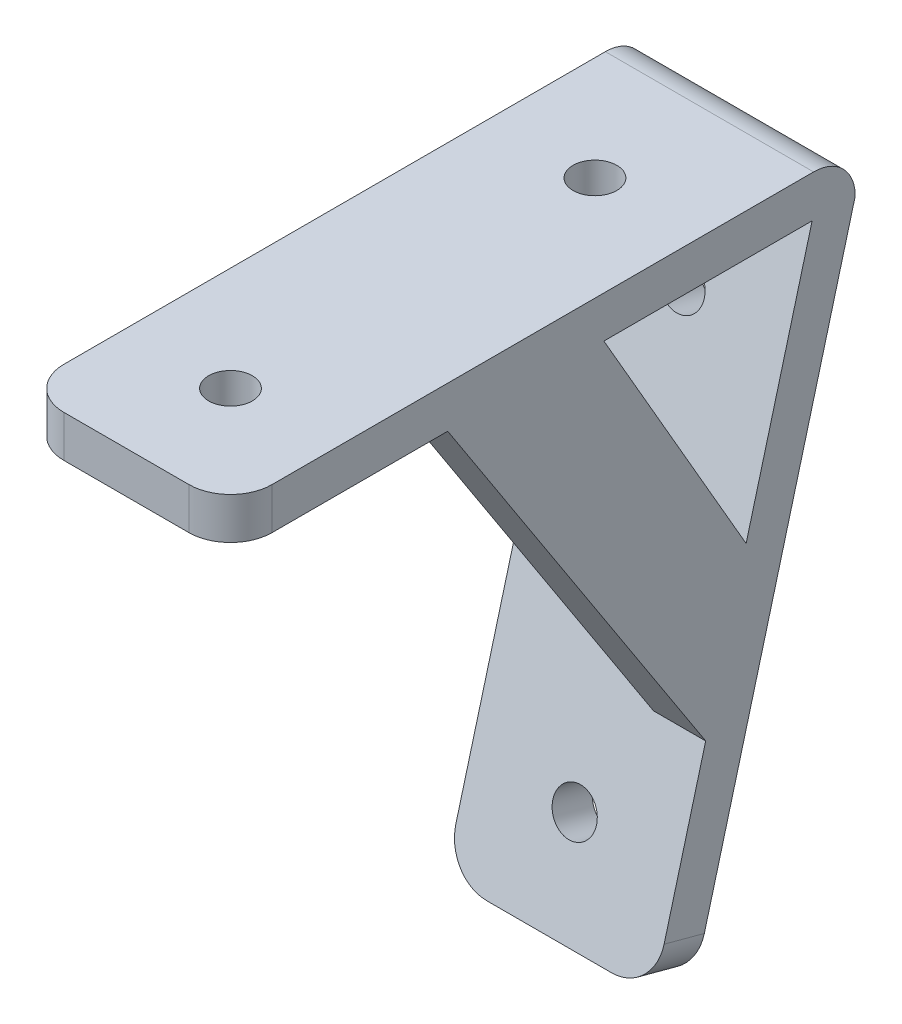
ISO-10303-21;
HEADER;
FILE_DESCRIPTION(('STEP AP214'),'2;1');
FILE_NAME('part.step','',(''),(''),'','','');
FILE_SCHEMA(('AUTOMOTIVE_DESIGN { 1 0 10303 214 1 1 1 1 }'));
ENDSEC;
DATA;
#1=APPLICATION_CONTEXT('core data for automotive mechanical design processes');
#2=APPLICATION_PROTOCOL_DEFINITION('international standard','automotive_design',2000,#1);
#3=PRODUCT_CONTEXT('',#1,'mechanical');
#4=PRODUCT('Part','Part','',(#3));
#5=PRODUCT_RELATED_PRODUCT_CATEGORY('part','',(#4));
#6=PRODUCT_DEFINITION_FORMATION('','',#4);
#7=PRODUCT_DEFINITION_CONTEXT('part definition',#1,'design');
#8=PRODUCT_DEFINITION('design','',#6,#7);
#9=PRODUCT_DEFINITION_SHAPE('','',#8);
#10=(LENGTH_UNIT() NAMED_UNIT(*) SI_UNIT(.MILLI.,.METRE.));
#11=(NAMED_UNIT(*) PLANE_ANGLE_UNIT() SI_UNIT($,.RADIAN.));
#12=(NAMED_UNIT(*) SI_UNIT($,.STERADIAN.) SOLID_ANGLE_UNIT());
#13=UNCERTAINTY_MEASURE_WITH_UNIT(LENGTH_MEASURE(1.E-05),#10,'distance_accuracy_value','');
#14=(GEOMETRIC_REPRESENTATION_CONTEXT(3) GLOBAL_UNCERTAINTY_ASSIGNED_CONTEXT((#13)) GLOBAL_UNIT_ASSIGNED_CONTEXT((#10,
#11,#12)) REPRESENTATION_CONTEXT('',''));
#15=CARTESIAN_POINT('',(0.,0.,0.));
#16=DIRECTION('',(0.,0.,1.));
#17=DIRECTION('',(1.,0.,0.));
#18=AXIS2_PLACEMENT_3D('',#15,#16,#17);
#19=CARTESIAN_POINT('',(-6.,4.,26.));
#20=DIRECTION('',(0.,-1.,0.));
#21=DIRECTION('',(0.,0.,-1.));
#22=AXIS2_PLACEMENT_3D('',#19,#20,#21);
#23=CYLINDRICAL_SURFACE('',#22,4.);
#24=DIRECTION('',(0.,-1.,0.));
#25=VECTOR('',#24,1.);
#26=CARTESIAN_POINT('',(-6.,4.,30.));
#27=LINE('',#26,#25);
#28=CARTESIAN_POINT('',(-6.,4.,30.));
#29=VERTEX_POINT('',#28);
#30=CARTESIAN_POINT('',(-6.,0.,30.));
#31=VERTEX_POINT('',#30);
#32=EDGE_CURVE('E274',#29,#31,#27,.T.);
#33=ORIENTED_EDGE('',*,*,#32,.F.);
#34=CARTESIAN_POINT('',(-6.,4.,26.));
#35=DIRECTION('',(0.,1.,0.));
#36=DIRECTION('',(0.,0.,1.));
#37=AXIS2_PLACEMENT_3D('',#34,#35,#36);
#38=CIRCLE('',#37,4.);
#39=CARTESIAN_POINT('',(-10.,4.,26.));
#40=VERTEX_POINT('',#39);
#41=EDGE_CURVE('E40',#40,#29,#38,.T.);
#42=ORIENTED_EDGE('',*,*,#41,.F.);
#43=DIRECTION('',(0.,-1.,0.));
#44=VECTOR('',#43,1.);
#45=CARTESIAN_POINT('',(-10.,4.,26.));
#46=LINE('',#45,#44);
#47=CARTESIAN_POINT('',(-10.,0.,26.));
#48=VERTEX_POINT('',#47);
#49=EDGE_CURVE('E277',#48,#40,#46,.F.);
#50=ORIENTED_EDGE('',*,*,#49,.F.);
#51=CARTESIAN_POINT('',(-6.,0.,26.));
#52=DIRECTION('',(0.,1.,0.));
#53=DIRECTION('',(0.,0.,1.));
#54=AXIS2_PLACEMENT_3D('',#51,#52,#53);
#55=CIRCLE('',#54,4.);
#56=EDGE_CURVE('E11',#31,#48,#55,.F.);
#57=ORIENTED_EDGE('',*,*,#56,.F.);
#58=EDGE_LOOP('',(#33,#42,#50,#57));
#59=FACE_BOUND('',#58,.T.);
#60=ADVANCED_FACE('F33',(#59),#23,.T.);
#61=CARTESIAN_POINT('',(6.,4.,26.));
#62=DIRECTION('',(0.,-1.,0.));
#63=DIRECTION('',(0.,0.,-1.));
#64=AXIS2_PLACEMENT_3D('',#61,#62,#63);
#65=CYLINDRICAL_SURFACE('',#64,4.);
#66=DIRECTION('',(0.,-1.,0.));
#67=VECTOR('',#66,1.);
#68=CARTESIAN_POINT('',(10.,4.,26.));
#69=LINE('',#68,#67);
#70=CARTESIAN_POINT('',(10.,4.,26.));
#71=VERTEX_POINT('',#70);
#72=CARTESIAN_POINT('',(10.,0.,26.));
#73=VERTEX_POINT('',#72);
#74=EDGE_CURVE('E263',#71,#73,#69,.T.);
#75=ORIENTED_EDGE('',*,*,#74,.F.);
#76=CARTESIAN_POINT('',(6.,4.,26.));
#77=DIRECTION('',(0.,1.,0.));
#78=DIRECTION('',(0.,0.,1.));
#79=AXIS2_PLACEMENT_3D('',#76,#77,#78);
#80=CIRCLE('',#79,4.);
#81=CARTESIAN_POINT('',(6.,4.,30.));
#82=VERTEX_POINT('',#81);
#83=EDGE_CURVE('E269',#82,#71,#80,.T.);
#84=ORIENTED_EDGE('',*,*,#83,.F.);
#85=DIRECTION('',(0.,-1.,0.));
#86=VECTOR('',#85,1.);
#87=CARTESIAN_POINT('',(6.,4.,30.));
#88=LINE('',#87,#86);
#89=CARTESIAN_POINT('',(6.,0.,30.));
#90=VERTEX_POINT('',#89);
#91=EDGE_CURVE('E266',#90,#82,#88,.F.);
#92=ORIENTED_EDGE('',*,*,#91,.F.);
#93=CARTESIAN_POINT('',(6.,0.,26.));
#94=DIRECTION('',(0.,1.,0.));
#95=DIRECTION('',(0.,0.,1.));
#96=AXIS2_PLACEMENT_3D('',#93,#94,#95);
#97=CIRCLE('',#96,4.);
#98=EDGE_CURVE('E271',#73,#90,#97,.F.);
#99=ORIENTED_EDGE('',*,*,#98,.F.);
#100=EDGE_LOOP('',(#75,#84,#92,#99));
#101=FACE_BOUND('',#100,.T.);
#102=ADVANCED_FACE('F293',(#101),#65,.T.);
#103=CARTESIAN_POINT('',(6.,-38.8238970797569,41.4746286392742));
#104=DIRECTION('',(0.,0.258819045102518,0.965925826289069));
#105=DIRECTION('',(0.,-0.965925826289069,0.258819045102518));
#106=AXIS2_PLACEMENT_3D('',#103,#104,#105);
#107=CYLINDRICAL_SURFACE('',#106,4.);
#108=DIRECTION('',(0.,-0.258819045102518,-0.965925826289069));
#109=VECTOR('',#108,1.);
#110=CARTESIAN_POINT('',(10.,-38.8238970797569,41.4746286392742));
#111=LINE('',#110,#109);
#112=CARTESIAN_POINT('',(9.99999999999999,-53.0565700917778,-11.6424301691027));
#113=VERTEX_POINT('',#112);
#114=CARTESIAN_POINT('',(9.99999999999999,-54.0918462721879,-15.506133474259));
#115=VERTEX_POINT('',#114);
#116=EDGE_CURVE('E252',#113,#115,#111,.T.);
#117=ORIENTED_EDGE('',*,*,#116,.F.);
#118=CARTESIAN_POINT('',(6.,-53.0565700917778,-11.6424301691027));
#119=DIRECTION('',(0.,0.258819045102518,0.965925826289069));
#120=DIRECTION('',(0.,-0.965925826289069,0.258819045102518));
#121=AXIS2_PLACEMENT_3D('',#118,#119,#120);
#122=CIRCLE('',#121,4.);
#123=CARTESIAN_POINT('',(6.,-56.9202733969341,-10.6071539886927));
#124=VERTEX_POINT('',#123);
#125=EDGE_CURVE('E258',#124,#113,#122,.T.);
#126=ORIENTED_EDGE('',*,*,#125,.F.);
#127=DIRECTION('',(0.,-0.258819045102518,-0.965925826289069));
#128=VECTOR('',#127,1.);
#129=CARTESIAN_POINT('',(6.,-42.6876003849132,42.5099048196843));
#130=LINE('',#129,#128);
#131=CARTESIAN_POINT('',(6.,-57.9555495773441,-14.4708572938489));
#132=VERTEX_POINT('',#131);
#133=EDGE_CURVE('E255',#132,#124,#130,.F.);
#134=ORIENTED_EDGE('',*,*,#133,.F.);
#135=CARTESIAN_POINT('',(6.,-54.0918462721879,-15.506133474259));
#136=DIRECTION('',(0.,0.258819045102518,0.965925826289069));
#137=DIRECTION('',(0.,-0.965925826289069,0.258819045102518));
#138=AXIS2_PLACEMENT_3D('',#135,#136,#137);
#139=CIRCLE('',#138,4.);
#140=EDGE_CURVE('E261',#115,#132,#139,.F.);
#141=ORIENTED_EDGE('',*,*,#140,.F.);
#142=EDGE_LOOP('',(#117,#126,#134,#141));
#143=FACE_BOUND('',#142,.T.);
#144=ADVANCED_FACE('F342',(#143),#107,.T.);
#145=CARTESIAN_POINT('',(-6.,-38.8238970797569,41.4746286392742));
#146=DIRECTION('',(0.,-0.258819045102518,-0.965925826289069));
#147=DIRECTION('',(0.,0.965925826289069,-0.258819045102518));
#148=AXIS2_PLACEMENT_3D('',#145,#146,#147);
#149=CYLINDRICAL_SURFACE('',#148,4.);
#150=DIRECTION('',(0.,0.258819045102518,0.965925826289069));
#151=VECTOR('',#150,1.);
#152=CARTESIAN_POINT('',(-10.,-38.8238970797569,41.4746286392742));
#153=LINE('',#152,#151);
#154=CARTESIAN_POINT('',(-10.,-54.0918462721879,-15.506133474259));
#155=VERTEX_POINT('',#154);
#156=CARTESIAN_POINT('',(-10.,-53.0565700917778,-11.6424301691027));
#157=VERTEX_POINT('',#156);
#158=EDGE_CURVE('E241',#155,#157,#153,.T.);
#159=ORIENTED_EDGE('',*,*,#158,.F.);
#160=CARTESIAN_POINT('',(-6.,-54.0918462721879,-15.506133474259));
#161=DIRECTION('',(0.,0.258819045102518,0.965925826289069));
#162=DIRECTION('',(0.,-0.965925826289069,0.258819045102518));
#163=AXIS2_PLACEMENT_3D('',#160,#161,#162);
#164=CIRCLE('',#163,4.);
#165=CARTESIAN_POINT('',(-6.,-57.9555495773441,-14.4708572938489));
#166=VERTEX_POINT('',#165);
#167=EDGE_CURVE('E247',#166,#155,#164,.F.);
#168=ORIENTED_EDGE('',*,*,#167,.F.);
#169=DIRECTION('',(0.,0.258819045102518,0.965925826289069));
#170=VECTOR('',#169,1.);
#171=CARTESIAN_POINT('',(-6.,-42.6876003849132,42.5099048196843));
#172=LINE('',#171,#170);
#173=CARTESIAN_POINT('',(-6.,-56.9202733969341,-10.6071539886926));
#174=VERTEX_POINT('',#173);
#175=EDGE_CURVE('E244',#174,#166,#172,.F.);
#176=ORIENTED_EDGE('',*,*,#175,.F.);
#177=CARTESIAN_POINT('',(-6.,-53.0565700917778,-11.6424301691027));
#178=DIRECTION('',(0.,0.258819045102518,0.965925826289069));
#179=DIRECTION('',(0.,-0.965925826289069,0.258819045102518));
#180=AXIS2_PLACEMENT_3D('',#177,#178,#179);
#181=CIRCLE('',#180,4.);
#182=EDGE_CURVE('E249',#157,#174,#181,.T.);
#183=ORIENTED_EDGE('',*,*,#182,.F.);
#184=EDGE_LOOP('',(#159,#168,#176,#183));
#185=FACE_BOUND('',#184,.T.);
#186=ADVANCED_FACE('F324',(#185),#149,.T.);
#187=CARTESIAN_POINT('',(10.,0.,-26.));
#188=DIRECTION('',(-1.,0.,0.));
#189=DIRECTION('',(0.,0.,1.));
#190=AXIS2_PLACEMENT_3D('',#187,#188,#189);
#191=CYLINDRICAL_SURFACE('',#190,4.);
#192=DIRECTION('',(-1.,0.,0.));
#193=VECTOR('',#192,1.);
#194=CARTESIAN_POINT('',(10.,0.,-30.));
#195=LINE('',#194,#193);
#196=CARTESIAN_POINT('',(10.,0.,-30.));
#197=VERTEX_POINT('',#196);
#198=CARTESIAN_POINT('',(-10.,0.,-30.));
#199=VERTEX_POINT('',#198);
#200=EDGE_CURVE('E216',#197,#199,#195,.T.);
#201=ORIENTED_EDGE('',*,*,#200,.T.);
#202=CARTESIAN_POINT('',(-10.,0.,-26.));
#203=DIRECTION('',(1.,0.,0.));
#204=DIRECTION('',(0.,0.,-1.));
#205=AXIS2_PLACEMENT_3D('',#202,#203,#204);
#206=CIRCLE('',#205,4.);
#207=CARTESIAN_POINT('',(-10.,4.,-26.));
#208=VERTEX_POINT('',#207);
#209=EDGE_CURVE('E235',#208,#199,#206,.F.);
#210=ORIENTED_EDGE('',*,*,#209,.F.);
#211=DIRECTION('',(1.,0.,0.));
#212=VECTOR('',#211,1.);
#213=CARTESIAN_POINT('',(10.,4.,-26.));
#214=LINE('',#213,#212);
#215=CARTESIAN_POINT('',(10.,4.,-26.));
#216=VERTEX_POINT('',#215);
#217=EDGE_CURVE('E232',#216,#208,#214,.F.);
#218=ORIENTED_EDGE('',*,*,#217,.F.);
#219=CARTESIAN_POINT('',(10.,0.,-26.));
#220=DIRECTION('',(-1.,0.,0.));
#221=DIRECTION('',(0.,0.,1.));
#222=AXIS2_PLACEMENT_3D('',#219,#220,#221);
#223=CIRCLE('',#222,4.);
#224=EDGE_CURVE('E238',#197,#216,#223,.F.);
#225=ORIENTED_EDGE('',*,*,#224,.F.);
#226=EDGE_LOOP('',(#201,#210,#218,#225));
#227=FACE_BOUND('',#226,.T.);
#228=ADVANCED_FACE('F300',(#227),#191,.T.);
#229=CARTESIAN_POINT('',(-10.,4.,30.));
#230=DIRECTION('',(1.,0.,0.));
#231=DIRECTION('',(0.,0.,-1.));
#232=AXIS2_PLACEMENT_3D('',#229,#230,#231);
#233=PLANE('',#232);
#234=DIRECTION('',(0.,0.,1.));
#235=VECTOR('',#234,1.);
#236=CARTESIAN_POINT('',(-10.,0.,30.));
#237=LINE('',#236,#235);
#238=CARTESIAN_POINT('',(-10.,0.,-25.8588952783597));
#239=VERTEX_POINT('',#238);
#240=EDGE_CURVE('E206',#239,#48,#237,.T.);
#241=ORIENTED_EDGE('',*,*,#240,.T.);
#242=ORIENTED_EDGE('',*,*,#49,.T.);
#243=DIRECTION('',(0.,0.,1.));
#244=VECTOR('',#243,1.);
#245=CARTESIAN_POINT('',(-10.,4.,30.));
#246=LINE('',#245,#244);
#247=EDGE_CURVE('E212',#208,#40,#246,.T.);
#248=ORIENTED_EDGE('',*,*,#247,.F.);
#249=ORIENTED_EDGE('',*,*,#209,.T.);
#250=DIRECTION('',(0.,0.965925826289069,-0.258819045102518));
#251=VECTOR('',#250,1.);
#252=CARTESIAN_POINT('',(-10.,0.,-30.));
#253=LINE('',#252,#251);
#254=EDGE_CURVE('E195',#155,#199,#253,.T.);
#255=ORIENTED_EDGE('',*,*,#254,.F.);
#256=ORIENTED_EDGE('',*,*,#158,.T.);
#257=DIRECTION('',(0.,0.965925826289069,-0.258819045102518));
#258=VECTOR('',#257,1.);
#259=CARTESIAN_POINT('',(-10.,1.03527618041007,-26.1362966948437));
#260=LINE('',#259,#258);
#261=EDGE_CURVE('E198',#157,#239,#260,.T.);
#262=ORIENTED_EDGE('',*,*,#261,.T.);
#263=EDGE_LOOP('',(#241,#242,#248,#249,#255,#256,#262));
#264=FACE_BOUND('',#263,.T.);
#265=ADVANCED_FACE('F303',(#264),#233,.F.);
#266=CARTESIAN_POINT('',(10.,4.,30.));
#267=DIRECTION('',(0.,0.,-1.));
#268=DIRECTION('',(-1.,0.,0.));
#269=AXIS2_PLACEMENT_3D('',#266,#267,#268);
#270=PLANE('',#269);
#271=DIRECTION('',(1.,0.,0.));
#272=VECTOR('',#271,1.);
#273=CARTESIAN_POINT('',(10.,4.,30.));
#274=LINE('',#273,#272);
#275=EDGE_CURVE('E215',#29,#82,#274,.T.);
#276=ORIENTED_EDGE('',*,*,#275,.F.);
#277=ORIENTED_EDGE('',*,*,#32,.T.);
#278=DIRECTION('',(1.,0.,0.));
#279=VECTOR('',#278,1.);
#280=CARTESIAN_POINT('',(10.,0.,30.));
#281=LINE('',#280,#279);
#282=EDGE_CURVE('E223',#31,#90,#281,.T.);
#283=ORIENTED_EDGE('',*,*,#282,.T.);
#284=ORIENTED_EDGE('',*,*,#91,.T.);
#285=EDGE_LOOP('',(#276,#277,#283,#284));
#286=FACE_BOUND('',#285,.T.);
#287=ADVANCED_FACE('F289',(#286),#270,.F.);
#288=CARTESIAN_POINT('',(10.,4.,30.));
#289=DIRECTION('',(-1.,0.,0.));
#290=DIRECTION('',(0.,0.,1.));
#291=AXIS2_PLACEMENT_3D('',#288,#289,#290);
#292=PLANE('',#291);
#293=DIRECTION('',(0.,0.,-1.));
#294=VECTOR('',#293,1.);
#295=CARTESIAN_POINT('',(10.,0.,30.));
#296=LINE('',#295,#294);
#297=CARTESIAN_POINT('',(10.,0.,9.14110472164032));
#298=VERTEX_POINT('',#297);
#299=EDGE_CURVE('E226',#73,#298,#296,.T.);
#300=ORIENTED_EDGE('',*,*,#299,.T.);
#301=DIRECTION('',(0.,-0.838634154062119,-0.544695103374828));
#302=VECTOR('',#301,1.);
#303=CARTESIAN_POINT('',(10.,-38.1491414321803,-15.6368636396664));
#304=LINE('',#303,#302);
#305=CARTESIAN_POINT('',(9.99999999999999,-38.1491414321803,-15.6368636396664));
#306=VERTEX_POINT('',#305);
#307=EDGE_CURVE('E55',#298,#306,#304,.T.);
#308=ORIENTED_EDGE('',*,*,#307,.T.);
#309=DIRECTION('',(0.,-0.965925826289069,0.258819045102518));
#310=VECTOR('',#309,1.);
#311=CARTESIAN_POINT('',(10.,1.03527618041007,-26.1362966948437));
#312=LINE('',#311,#310);
#313=EDGE_CURVE('E200',#306,#113,#312,.T.);
#314=ORIENTED_EDGE('',*,*,#313,.T.);
#315=ORIENTED_EDGE('',*,*,#116,.T.);
#316=DIRECTION('',(0.,-0.965925826289069,0.258819045102518));
#317=VECTOR('',#316,1.);
#318=CARTESIAN_POINT('',(10.,0.,-30.));
#319=LINE('',#318,#317);
#320=EDGE_CURVE('E208',#197,#115,#319,.T.);
#321=ORIENTED_EDGE('',*,*,#320,.F.);
#322=ORIENTED_EDGE('',*,*,#224,.T.);
#323=DIRECTION('',(0.,0.,-1.));
#324=VECTOR('',#323,1.);
#325=CARTESIAN_POINT('',(10.,4.,30.));
#326=LINE('',#325,#324);
#327=EDGE_CURVE('E218',#71,#216,#326,.T.);
#328=ORIENTED_EDGE('',*,*,#327,.F.);
#329=ORIENTED_EDGE('',*,*,#74,.T.);
#330=EDGE_LOOP('',(#300,#308,#314,#315,#321,#322,#328,#329));
#331=FACE_BOUND('',#330,.T.);
#332=DIRECTION('',(0.,0.866025403784436,0.500000000000004));
#333=VECTOR('',#332,1.);
#334=CARTESIAN_POINT('',(10.,0.,-5.85889527835968));
#335=LINE('',#334,#333);
#336=CARTESIAN_POINT('',(10.,-23.6602540378443,-19.5191493162042));
#337=VERTEX_POINT('',#336);
#338=CARTESIAN_POINT('',(10.,0.,-5.85889527835968));
#339=VERTEX_POINT('',#338);
#340=EDGE_CURVE('E47',#337,#339,#335,.T.);
#341=ORIENTED_EDGE('',*,*,#340,.T.);
#342=CARTESIAN_POINT('',(10.,0.,-25.8588952783597));
#343=VERTEX_POINT('',#342);
#344=EDGE_CURVE('E225',#339,#343,#296,.T.);
#345=ORIENTED_EDGE('',*,*,#344,.T.);
#346=EDGE_CURVE('E202',#343,#337,#312,.T.);
#347=ORIENTED_EDGE('',*,*,#346,.T.);
#348=EDGE_LOOP('',(#341,#345,#347));
#349=FACE_BOUND('',#348,.T.);
#350=ADVANCED_FACE('F297',(#331,#349),#292,.F.);
#351=CARTESIAN_POINT('',(0.,4.,0.));
#352=DIRECTION('',(0.,1.,0.));
#353=DIRECTION('',(0.,0.,1.));
#354=AXIS2_PLACEMENT_3D('',#351,#352,#353);
#355=PLANE('',#354);
#356=CARTESIAN_POINT('',(0.,4.,-15.));
#357=DIRECTION('',(0.,-1.,0.));
#358=DIRECTION('',(0.,0.,-1.));
#359=AXIS2_PLACEMENT_3D('',#356,#357,#358);
#360=CIRCLE('',#359,2.1);
#361=CARTESIAN_POINT('',(0.,4.,-17.1));
#362=VERTEX_POINT('',#361);
#363=EDGE_CURVE('E186',#362,#362,#360,.T.);
#364=ORIENTED_EDGE('',*,*,#363,.T.);
#365=EDGE_LOOP('',(#364));
#366=FACE_BOUND('',#365,.T.);
#367=CARTESIAN_POINT('',(0.,4.,20.));
#368=DIRECTION('',(0.,-1.,0.));
#369=DIRECTION('',(0.,0.,-1.));
#370=AXIS2_PLACEMENT_3D('',#367,#368,#369);
#371=CIRCLE('',#370,2.1);
#372=CARTESIAN_POINT('',(0.,4.,17.9));
#373=VERTEX_POINT('',#372);
#374=EDGE_CURVE('E192',#373,#373,#371,.T.);
#375=ORIENTED_EDGE('',*,*,#374,.T.);
#376=EDGE_LOOP('',(#375));
#377=FACE_BOUND('',#376,.T.);
#378=ORIENTED_EDGE('',*,*,#247,.T.);
#379=ORIENTED_EDGE('',*,*,#41,.T.);
#380=ORIENTED_EDGE('',*,*,#275,.T.);
#381=ORIENTED_EDGE('',*,*,#83,.T.);
#382=ORIENTED_EDGE('',*,*,#327,.T.);
#383=ORIENTED_EDGE('',*,*,#217,.T.);
#384=EDGE_LOOP('',(#378,#379,#380,#381,#382,#383));
#385=FACE_BOUND('',#384,.T.);
#386=ADVANCED_FACE('F281',(#366,#377,#385),#355,.T.);
#387=CARTESIAN_POINT('',(0.,0.,0.));
#388=DIRECTION('',(0.,1.,0.));
#389=DIRECTION('',(0.,0.,1.));
#390=AXIS2_PLACEMENT_3D('',#387,#388,#389);
#391=PLANE('',#390);
#392=CARTESIAN_POINT('',(0.,0.,-15.));
#393=DIRECTION('',(0.,-1.,0.));
#394=DIRECTION('',(0.,0.,-1.));
#395=AXIS2_PLACEMENT_3D('',#392,#393,#394);
#396=CIRCLE('',#395,2.1);
#397=CARTESIAN_POINT('',(0.,0.,-17.1));
#398=VERTEX_POINT('',#397);
#399=EDGE_CURVE('E183',#398,#398,#396,.T.);
#400=ORIENTED_EDGE('',*,*,#399,.F.);
#401=EDGE_LOOP('',(#400));
#402=FACE_BOUND('',#401,.T.);
#403=CARTESIAN_POINT('',(0.,0.,20.));
#404=DIRECTION('',(0.,-1.,0.));
#405=DIRECTION('',(0.,0.,-1.));
#406=AXIS2_PLACEMENT_3D('',#403,#404,#405);
#407=CIRCLE('',#406,2.1);
#408=CARTESIAN_POINT('',(0.,0.,17.9));
#409=VERTEX_POINT('',#408);
#410=EDGE_CURVE('E189',#409,#409,#407,.T.);
#411=ORIENTED_EDGE('',*,*,#410,.F.);
#412=EDGE_LOOP('',(#411));
#413=FACE_BOUND('',#412,.T.);
#414=DIRECTION('',(0.,0.,1.));
#415=VECTOR('',#414,1.);
#416=CARTESIAN_POINT('',(5.,0.,9.14110472164032));
#417=LINE('',#416,#415);
#418=CARTESIAN_POINT('',(5.,0.,-5.85889527835968));
#419=VERTEX_POINT('',#418);
#420=CARTESIAN_POINT('',(5.,0.,9.14110472164032));
#421=VERTEX_POINT('',#420);
#422=EDGE_CURVE('E155',#419,#421,#417,.T.);
#423=ORIENTED_EDGE('',*,*,#422,.T.);
#424=DIRECTION('',(1.,0.,0.));
#425=VECTOR('',#424,1.);
#426=CARTESIAN_POINT('',(5.,0.,9.14110472164032));
#427=LINE('',#426,#425);
#428=EDGE_CURVE('E170',#421,#298,#427,.T.);
#429=ORIENTED_EDGE('',*,*,#428,.T.);
#430=ORIENTED_EDGE('',*,*,#299,.F.);
#431=ORIENTED_EDGE('',*,*,#98,.T.);
#432=ORIENTED_EDGE('',*,*,#282,.F.);
#433=ORIENTED_EDGE('',*,*,#56,.T.);
#434=ORIENTED_EDGE('',*,*,#240,.F.);
#435=DIRECTION('',(1.,0.,0.));
#436=VECTOR('',#435,1.);
#437=CARTESIAN_POINT('',(0.,0.,-25.8588952783597));
#438=LINE('',#437,#436);
#439=EDGE_CURVE('E220',#239,#343,#438,.T.);
#440=ORIENTED_EDGE('',*,*,#439,.T.);
#441=ORIENTED_EDGE('',*,*,#344,.F.);
#442=DIRECTION('',(1.,0.,0.));
#443=VECTOR('',#442,1.);
#444=CARTESIAN_POINT('',(5.,0.,-5.85889527835968));
#445=LINE('',#444,#443);
#446=EDGE_CURVE('E146',#419,#339,#445,.T.);
#447=ORIENTED_EDGE('',*,*,#446,.F.);
#448=EDGE_LOOP('',(#423,#429,#430,#431,#432,#433,#434,#440,#441,#447));
#449=FACE_BOUND('',#448,.T.);
#450=ADVANCED_FACE('F308',(#402,#413,#449),#391,.F.);
#451=CARTESIAN_POINT('',(0.,-6.46472381958985,-24.1266777516104));
#452=DIRECTION('',(0.,0.258819045102518,0.965925826289069));
#453=DIRECTION('',(0.,-0.965925826289069,0.258819045102518));
#454=AXIS2_PLACEMENT_3D('',#451,#452,#453);
#455=PLANE('',#454);
#456=DIRECTION('',(1.,0.,0.));
#457=VECTOR('',#456,1.);
#458=CARTESIAN_POINT('',(5.,-38.1491414321803,-15.6368636396664));
#459=LINE('',#458,#457);
#460=CARTESIAN_POINT('',(5.,-38.1491414321803,-15.6368636396664));
#461=VERTEX_POINT('',#460);
#462=EDGE_CURVE('E161',#461,#306,#459,.T.);
#463=ORIENTED_EDGE('',*,*,#462,.F.);
#464=DIRECTION('',(0.,0.965925826289069,-0.258819045102518));
#465=VECTOR('',#464,1.);
#466=CARTESIAN_POINT('',(5.,-23.6602540378443,-19.5191493162042));
#467=LINE('',#466,#465);
#468=CARTESIAN_POINT('',(5.,-23.6602540378443,-19.5191493162042));
#469=VERTEX_POINT('',#468);
#470=EDGE_CURVE('E152',#461,#469,#467,.T.);
#471=ORIENTED_EDGE('',*,*,#470,.T.);
#472=DIRECTION('',(1.,0.,0.));
#473=VECTOR('',#472,1.);
#474=CARTESIAN_POINT('',(5.,-23.6602540378443,-19.5191493162042));
#475=LINE('',#474,#473);
#476=EDGE_CURVE('E138',#469,#337,#475,.T.);
#477=ORIENTED_EDGE('',*,*,#476,.T.);
#478=ORIENTED_EDGE('',*,*,#346,.F.);
#479=ORIENTED_EDGE('',*,*,#439,.F.);
#480=ORIENTED_EDGE('',*,*,#261,.F.);
#481=ORIENTED_EDGE('',*,*,#182,.T.);
#482=DIRECTION('',(-1.,0.,0.));
#483=VECTOR('',#482,1.);
#484=CARTESIAN_POINT('',(-10.,-56.9202733969341,-10.6071539886926));
#485=LINE('',#484,#483);
#486=EDGE_CURVE('E204',#124,#174,#485,.T.);
#487=ORIENTED_EDGE('',*,*,#486,.F.);
#488=ORIENTED_EDGE('',*,*,#125,.T.);
#489=ORIENTED_EDGE('',*,*,#313,.F.);
#490=EDGE_LOOP('',(#463,#471,#477,#478,#479,#480,#481,#487,#488,#489));
#491=FACE_BOUND('',#490,.T.);
#492=CARTESIAN_POINT('',(0.,-47.7786532242484,-13.0566437314758));
#493=DIRECTION('',(0.,0.258819045102518,0.965925826289069));
#494=DIRECTION('',(0.,-0.965925826289069,0.258819045102518));
#495=AXIS2_PLACEMENT_3D('',#492,#493,#494);
#496=CIRCLE('',#495,2.1);
#497=CARTESIAN_POINT('',(0.,-49.8070974594555,-12.5131237367605));
#498=VERTEX_POINT('',#497);
#499=EDGE_CURVE('E169',#498,#498,#496,.T.);
#500=ORIENTED_EDGE('',*,*,#499,.F.);
#501=EDGE_LOOP('',(#500));
#502=FACE_BOUND('',#501,.T.);
#503=CARTESIAN_POINT('',(0.,-9.14162017268566,-23.4094055355765));
#504=DIRECTION('',(0.,0.258819045102518,0.965925826289069));
#505=DIRECTION('',(0.,-0.965925826289069,0.258819045102518));
#506=AXIS2_PLACEMENT_3D('',#503,#504,#505);
#507=CIRCLE('',#506,2.1);
#508=CARTESIAN_POINT('',(0.,-11.1700644078927,-22.8658855408612));
#509=VERTEX_POINT('',#508);
#510=EDGE_CURVE('E177',#509,#509,#507,.T.);
#511=ORIENTED_EDGE('',*,*,#510,.F.);
#512=EDGE_LOOP('',(#511));
#513=FACE_BOUND('',#512,.T.);
#514=ADVANCED_FACE('F158',(#491,#502,#513),#455,.T.);
#515=CARTESIAN_POINT('',(-10.,-56.9202733969341,-10.6071539886926));
#516=DIRECTION('',(0.,-0.965925826289069,0.258819045102518));
#517=DIRECTION('',(0.,-0.258819045102518,-0.965925826289069));
#518=AXIS2_PLACEMENT_3D('',#515,#516,#517);
#519=PLANE('',#518);
#520=DIRECTION('',(-1.,0.,0.));
#521=VECTOR('',#520,1.);
#522=CARTESIAN_POINT('',(-10.,-57.9555495773441,-14.4708572938489));
#523=LINE('',#522,#521);
#524=EDGE_CURVE('E201',#132,#166,#523,.T.);
#525=ORIENTED_EDGE('',*,*,#524,.F.);
#526=ORIENTED_EDGE('',*,*,#133,.T.);
#527=ORIENTED_EDGE('',*,*,#486,.T.);
#528=ORIENTED_EDGE('',*,*,#175,.T.);
#529=EDGE_LOOP('',(#525,#526,#527,#528));
#530=FACE_BOUND('',#529,.T.);
#531=ADVANCED_FACE('F374',(#530),#519,.T.);
#532=CARTESIAN_POINT('',(0.,-7.49999999999993,-27.9903810567666));
#533=DIRECTION('',(0.,0.258819045102518,0.965925826289069));
#534=DIRECTION('',(0.,-0.965925826289069,0.258819045102518));
#535=AXIS2_PLACEMENT_3D('',#532,#533,#534);
#536=PLANE('',#535);
#537=CARTESIAN_POINT('',(0.,-48.8139294046585,-16.9203470366321));
#538=DIRECTION('',(0.,0.258819045102518,0.965925826289069));
#539=DIRECTION('',(0.,-0.965925826289069,0.258819045102518));
#540=AXIS2_PLACEMENT_3D('',#537,#538,#539);
#541=CIRCLE('',#540,2.1);
#542=CARTESIAN_POINT('',(0.,-50.8423736398655,-16.3768270419168));
#543=VERTEX_POINT('',#542);
#544=EDGE_CURVE('E174',#543,#543,#541,.T.);
#545=ORIENTED_EDGE('',*,*,#544,.T.);
#546=EDGE_LOOP('',(#545));
#547=FACE_BOUND('',#546,.T.);
#548=CARTESIAN_POINT('',(0.,-10.1768963530957,-27.2731088407328));
#549=DIRECTION('',(0.,0.258819045102518,0.965925826289069));
#550=DIRECTION('',(0.,-0.965925826289069,0.258819045102518));
#551=AXIS2_PLACEMENT_3D('',#548,#549,#550);
#552=CIRCLE('',#551,2.1);
#553=CARTESIAN_POINT('',(0.,-12.2053405883028,-26.7295888460175));
#554=VERTEX_POINT('',#553);
#555=EDGE_CURVE('E180',#554,#554,#552,.T.);
#556=ORIENTED_EDGE('',*,*,#555,.T.);
#557=EDGE_LOOP('',(#556));
#558=FACE_BOUND('',#557,.T.);
#559=ORIENTED_EDGE('',*,*,#320,.T.);
#560=ORIENTED_EDGE('',*,*,#140,.T.);
#561=ORIENTED_EDGE('',*,*,#524,.T.);
#562=ORIENTED_EDGE('',*,*,#167,.T.);
#563=ORIENTED_EDGE('',*,*,#254,.T.);
#564=ORIENTED_EDGE('',*,*,#200,.F.);
#565=EDGE_LOOP('',(#559,#560,#561,#562,#563,#564));
#566=FACE_BOUND('',#565,.T.);
#567=ADVANCED_FACE('F317',(#547,#558,#566),#536,.F.);
#568=CARTESIAN_POINT('',(0.,4.,20.));
#569=DIRECTION('',(0.,-1.,0.));
#570=DIRECTION('',(0.,0.,-1.));
#571=AXIS2_PLACEMENT_3D('',#568,#569,#570);
#572=CYLINDRICAL_SURFACE('',#571,2.1);
#573=ORIENTED_EDGE('',*,*,#374,.F.);
#574=EDGE_LOOP('',(#573));
#575=FACE_BOUND('',#574,.T.);
#576=ORIENTED_EDGE('',*,*,#410,.T.);
#577=EDGE_LOOP('',(#576));
#578=FACE_BOUND('',#577,.T.);
#579=ADVANCED_FACE('F388',(#575,#578),#572,.F.);
#580=CARTESIAN_POINT('',(0.,4.,-15.));
#581=DIRECTION('',(0.,-1.,0.));
#582=DIRECTION('',(0.,0.,-1.));
#583=AXIS2_PLACEMENT_3D('',#580,#581,#582);
#584=CYLINDRICAL_SURFACE('',#583,2.1);
#585=ORIENTED_EDGE('',*,*,#363,.F.);
#586=EDGE_LOOP('',(#585));
#587=FACE_BOUND('',#586,.T.);
#588=ORIENTED_EDGE('',*,*,#399,.T.);
#589=EDGE_LOOP('',(#588));
#590=FACE_BOUND('',#589,.T.);
#591=ADVANCED_FACE('F448',(#587,#590),#584,.F.);
#592=CARTESIAN_POINT('',(0.,-10.1768963530957,-27.2731088407328));
#593=DIRECTION('',(0.,0.258819045102518,0.965925826289069));
#594=DIRECTION('',(0.,-0.965925826289069,0.258819045102518));
#595=AXIS2_PLACEMENT_3D('',#592,#593,#594);
#596=CYLINDRICAL_SURFACE('',#595,2.1);
#597=ORIENTED_EDGE('',*,*,#555,.F.);
#598=EDGE_LOOP('',(#597));
#599=FACE_BOUND('',#598,.T.);
#600=ORIENTED_EDGE('',*,*,#510,.T.);
#601=EDGE_LOOP('',(#600));
#602=FACE_BOUND('',#601,.T.);
#603=ADVANCED_FACE('F440',(#599,#602),#596,.F.);
#604=CARTESIAN_POINT('',(0.,-48.8139294046585,-16.9203470366321));
#605=DIRECTION('',(0.,0.258819045102518,0.965925826289069));
#606=DIRECTION('',(0.,-0.965925826289069,0.258819045102518));
#607=AXIS2_PLACEMENT_3D('',#604,#605,#606);
#608=CYLINDRICAL_SURFACE('',#607,2.1);
#609=ORIENTED_EDGE('',*,*,#544,.F.);
#610=EDGE_LOOP('',(#609));
#611=FACE_BOUND('',#610,.T.);
#612=ORIENTED_EDGE('',*,*,#499,.T.);
#613=EDGE_LOOP('',(#612));
#614=FACE_BOUND('',#613,.T.);
#615=ADVANCED_FACE('F417',(#611,#614),#608,.F.);
#616=CARTESIAN_POINT('',(5.,-38.1491414321803,-15.6368636396664));
#617=DIRECTION('',(0.,-0.544695103374828,0.838634154062119));
#618=DIRECTION('',(0.,-0.838634154062119,-0.544695103374828));
#619=AXIS2_PLACEMENT_3D('',#616,#617,#618);
#620=PLANE('',#619);
#621=ORIENTED_EDGE('',*,*,#307,.F.);
#622=ORIENTED_EDGE('',*,*,#428,.F.);
#623=DIRECTION('',(0.,-0.838634154062119,-0.544695103374828));
#624=VECTOR('',#623,1.);
#625=CARTESIAN_POINT('',(5.,-38.1491414321803,-15.6368636396664));
#626=LINE('',#625,#624);
#627=EDGE_CURVE('E147',#421,#461,#626,.T.);
#628=ORIENTED_EDGE('',*,*,#627,.T.);
#629=ORIENTED_EDGE('',*,*,#462,.T.);
#630=EDGE_LOOP('',(#621,#622,#628,#629));
#631=FACE_BOUND('',#630,.T.);
#632=ADVANCED_FACE('F312',(#631),#620,.T.);
#633=CARTESIAN_POINT('',(5.,0.,-5.85889527835968));
#634=DIRECTION('',(0.,0.500000000000004,-0.866025403784436));
#635=DIRECTION('',(0.,0.866025403784436,0.500000000000004));
#636=AXIS2_PLACEMENT_3D('',#633,#634,#635);
#637=PLANE('',#636);
#638=ORIENTED_EDGE('',*,*,#340,.F.);
#639=ORIENTED_EDGE('',*,*,#476,.F.);
#640=DIRECTION('',(0.,0.866025403784436,0.500000000000004));
#641=VECTOR('',#640,1.);
#642=CARTESIAN_POINT('',(5.,0.,-5.85889527835968));
#643=LINE('',#642,#641);
#644=EDGE_CURVE('E141',#469,#419,#643,.T.);
#645=ORIENTED_EDGE('',*,*,#644,.T.);
#646=ORIENTED_EDGE('',*,*,#446,.T.);
#647=EDGE_LOOP('',(#638,#639,#645,#646));
#648=FACE_BOUND('',#647,.T.);
#649=ADVANCED_FACE('F140',(#648),#637,.T.);
#650=CARTESIAN_POINT('',(5.,0.,0.));
#651=DIRECTION('',(1.,0.,0.));
#652=DIRECTION('',(0.,0.,-1.));
#653=AXIS2_PLACEMENT_3D('',#650,#651,#652);
#654=PLANE('',#653);
#655=ORIENTED_EDGE('',*,*,#470,.F.);
#656=ORIENTED_EDGE('',*,*,#627,.F.);
#657=ORIENTED_EDGE('',*,*,#422,.F.);
#658=ORIENTED_EDGE('',*,*,#644,.F.);
#659=EDGE_LOOP('',(#655,#656,#657,#658));
#660=FACE_BOUND('',#659,.T.);
#661=ADVANCED_FACE('F150',(#660),#654,.F.);
#662=CLOSED_SHELL('',(#60,#102,#144,#186,#228,#265,#287,#350,#386,#450,#514,#531,#567,#579,#591,
#603,#615,#632,#649,#661));
#663=MANIFOLD_SOLID_BREP('B2',#662);
#664=ADVANCED_BREP_SHAPE_REPRESENTATION('',(#18,#663),#14);
#665=SHAPE_DEFINITION_REPRESENTATION(#9,#664);
ENDSEC;
END-ISO-10303-21;
